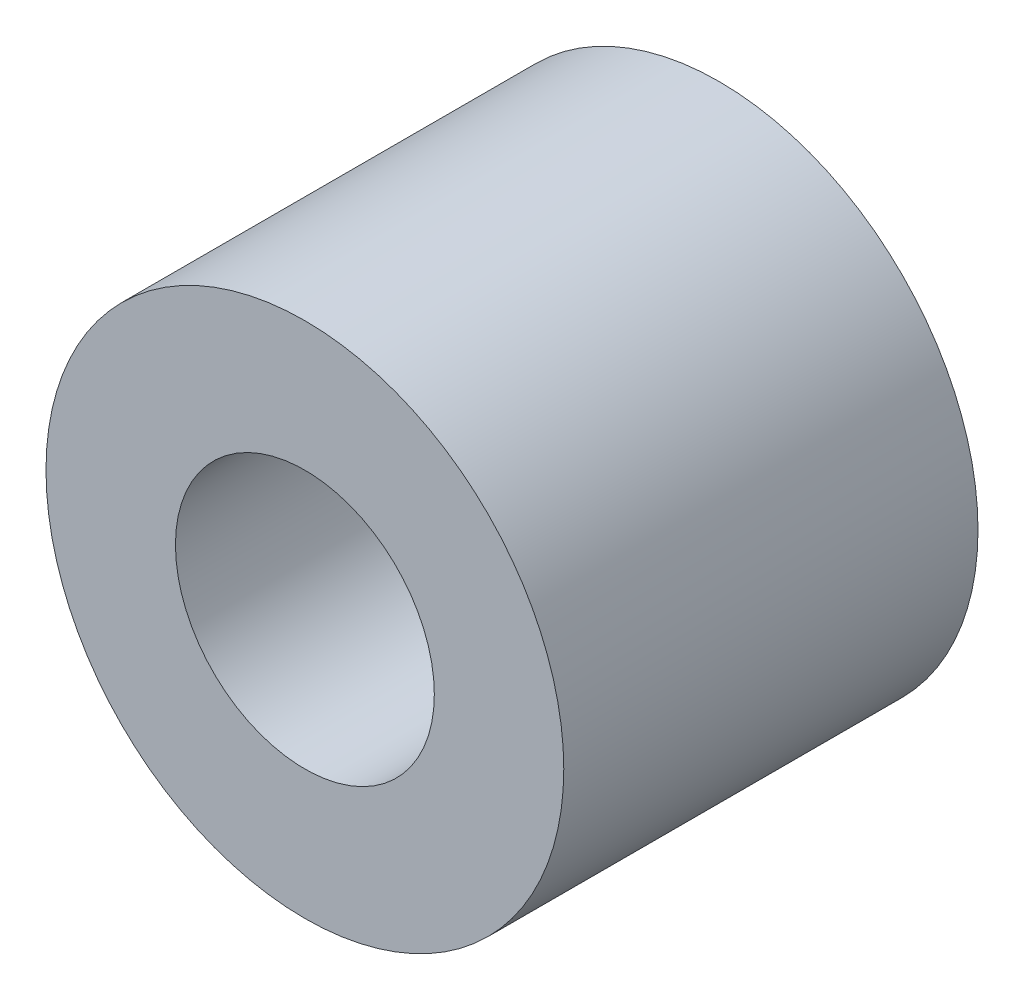
ISO-10303-21;
HEADER;
FILE_DESCRIPTION(('STEP AP214'),'2;1');
FILE_NAME('part.step','',(''),(''),'','','');
FILE_SCHEMA(('AUTOMOTIVE_DESIGN { 1 0 10303 214 1 1 1 1 }'));
ENDSEC;
DATA;
#1=APPLICATION_CONTEXT('core data for automotive mechanical design processes');
#2=APPLICATION_PROTOCOL_DEFINITION('international standard','automotive_design',2000,#1);
#3=PRODUCT_CONTEXT('',#1,'mechanical');
#4=PRODUCT('Part','Part','',(#3));
#5=PRODUCT_RELATED_PRODUCT_CATEGORY('part','',(#4));
#6=PRODUCT_DEFINITION_FORMATION('','',#4);
#7=PRODUCT_DEFINITION_CONTEXT('part definition',#1,'design');
#8=PRODUCT_DEFINITION('design','',#6,#7);
#9=PRODUCT_DEFINITION_SHAPE('','',#8);
#10=(LENGTH_UNIT() NAMED_UNIT(*) SI_UNIT(.MILLI.,.METRE.));
#11=(NAMED_UNIT(*) PLANE_ANGLE_UNIT() SI_UNIT($,.RADIAN.));
#12=(NAMED_UNIT(*) SI_UNIT($,.STERADIAN.) SOLID_ANGLE_UNIT());
#13=UNCERTAINTY_MEASURE_WITH_UNIT(LENGTH_MEASURE(1.E-05),#10,'distance_accuracy_value','');
#14=(GEOMETRIC_REPRESENTATION_CONTEXT(3) GLOBAL_UNCERTAINTY_ASSIGNED_CONTEXT((#13)) GLOBAL_UNIT_ASSIGNED_CONTEXT((#10,
#11,#12)) REPRESENTATION_CONTEXT('',''));
#15=CARTESIAN_POINT('',(0.,0.,0.));
#16=DIRECTION('',(0.,0.,1.));
#17=DIRECTION('',(1.,0.,0.));
#18=AXIS2_PLACEMENT_3D('',#15,#16,#17);
#19=CARTESIAN_POINT('',(0.,0.,5.08));
#20=DIRECTION('',(0.,0.,-1.));
#21=DIRECTION('',(-1.,0.,0.));
#22=AXIS2_PLACEMENT_3D('',#19,#20,#21);
#23=CYLINDRICAL_SURFACE('',#22,3.175);
#24=CARTESIAN_POINT('',(0.,0.,5.08));
#25=DIRECTION('',(0.,0.,1.));
#26=DIRECTION('',(1.,0.,0.));
#27=AXIS2_PLACEMENT_3D('',#24,#25,#26);
#28=CIRCLE('',#27,3.175);
#29=CARTESIAN_POINT('',(3.175,0.,5.08));
#30=VERTEX_POINT('',#29);
#31=EDGE_CURVE('E10',#30,#30,#28,.T.);
#32=ORIENTED_EDGE('',*,*,#31,.F.);
#33=EDGE_LOOP('',(#32));
#34=FACE_BOUND('',#33,.T.);
#35=CARTESIAN_POINT('',(0.,0.,0.));
#36=DIRECTION('',(0.,0.,1.));
#37=DIRECTION('',(1.,0.,0.));
#38=AXIS2_PLACEMENT_3D('',#35,#36,#37);
#39=CIRCLE('',#38,3.175);
#40=CARTESIAN_POINT('',(3.175,0.,0.));
#41=VERTEX_POINT('',#40);
#42=EDGE_CURVE('E34',#41,#41,#39,.T.);
#43=ORIENTED_EDGE('',*,*,#42,.T.);
#44=EDGE_LOOP('',(#43));
#45=FACE_BOUND('',#44,.T.);
#46=ADVANCED_FACE('F31',(#34,#45),#23,.T.);
#47=CARTESIAN_POINT('',(0.,0.,5.08));
#48=DIRECTION('',(0.,0.,1.));
#49=DIRECTION('',(1.,0.,0.));
#50=AXIS2_PLACEMENT_3D('',#47,#48,#49);
#51=PLANE('',#50);
#52=CARTESIAN_POINT('',(0.,0.,5.08));
#53=DIRECTION('',(0.,0.,1.));
#54=DIRECTION('',(1.,0.,0.));
#55=AXIS2_PLACEMENT_3D('',#52,#53,#54);
#56=CIRCLE('',#55,1.5875);
#57=CARTESIAN_POINT('',(1.5875,0.,5.08));
#58=VERTEX_POINT('',#57);
#59=EDGE_CURVE('E43',#58,#58,#56,.T.);
#60=ORIENTED_EDGE('',*,*,#59,.F.);
#61=EDGE_LOOP('',(#60));
#62=FACE_BOUND('',#61,.T.);
#63=ORIENTED_EDGE('',*,*,#31,.T.);
#64=EDGE_LOOP('',(#63));
#65=FACE_BOUND('',#64,.T.);
#66=ADVANCED_FACE('F58',(#62,#65),#51,.T.);
#67=CARTESIAN_POINT('',(0.,0.,0.));
#68=DIRECTION('',(0.,0.,1.));
#69=DIRECTION('',(1.,0.,0.));
#70=AXIS2_PLACEMENT_3D('',#67,#68,#69);
#71=PLANE('',#70);
#72=ORIENTED_EDGE('',*,*,#42,.F.);
#73=EDGE_LOOP('',(#72));
#74=FACE_BOUND('',#73,.T.);
#75=ADVANCED_FACE('F54',(#74),#71,.F.);
#76=CARTESIAN_POINT('',(0.,0.,1.27));
#77=DIRECTION('',(0.,0.,1.));
#78=DIRECTION('',(1.,0.,0.));
#79=AXIS2_PLACEMENT_3D('',#76,#77,#78);
#80=CYLINDRICAL_SURFACE('',#79,1.5875);
#81=CARTESIAN_POINT('',(0.,0.,1.27));
#82=DIRECTION('',(0.,0.,1.));
#83=DIRECTION('',(1.,0.,0.));
#84=AXIS2_PLACEMENT_3D('',#81,#82,#83);
#85=CIRCLE('',#84,1.5875);
#86=CARTESIAN_POINT('',(1.5875,0.,1.27));
#87=VERTEX_POINT('',#86);
#88=EDGE_CURVE('E41',#87,#87,#85,.T.);
#89=CARTESIAN_POINT('',(1.5875,0.,1.27));
#90=CARTESIAN_POINT('',(1.5875,0.,1.3096875));
#91=CARTESIAN_POINT('',(1.5875,0.,1.349375));
#92=CARTESIAN_POINT('',(1.5875,0.,1.42875));
#93=CARTESIAN_POINT('',(1.5875,0.,1.4684375));
#94=CARTESIAN_POINT('',(1.5875,0.,1.5478125));
#95=CARTESIAN_POINT('',(1.5875,0.,1.5875));
#96=CARTESIAN_POINT('',(1.5875,0.,1.666875));
#97=CARTESIAN_POINT('',(1.5875,0.,1.7065625));
#98=CARTESIAN_POINT('',(1.5875,0.,1.7859375));
#99=CARTESIAN_POINT('',(1.5875,0.,1.825625));
#100=CARTESIAN_POINT('',(1.5875,0.,1.905));
#101=CARTESIAN_POINT('',(1.5875,0.,1.9446875));
#102=CARTESIAN_POINT('',(1.5875,0.,2.0240625));
#103=CARTESIAN_POINT('',(1.5875,0.,2.06375));
#104=CARTESIAN_POINT('',(1.5875,0.,2.143125));
#105=CARTESIAN_POINT('',(1.5875,0.,2.1828125));
#106=CARTESIAN_POINT('',(1.5875,0.,2.2621875));
#107=CARTESIAN_POINT('',(1.5875,0.,2.301875));
#108=CARTESIAN_POINT('',(1.5875,0.,2.38125));
#109=CARTESIAN_POINT('',(1.5875,0.,2.4209375));
#110=CARTESIAN_POINT('',(1.5875,0.,2.5003125));
#111=CARTESIAN_POINT('',(1.5875,0.,2.54));
#112=CARTESIAN_POINT('',(1.5875,0.,2.619375));
#113=CARTESIAN_POINT('',(1.5875,0.,2.6590625));
#114=CARTESIAN_POINT('',(1.5875,0.,2.7384375));
#115=CARTESIAN_POINT('',(1.5875,0.,2.778125));
#116=CARTESIAN_POINT('',(1.5875,0.,2.8575));
#117=CARTESIAN_POINT('',(1.5875,0.,2.8971875));
#118=CARTESIAN_POINT('',(1.5875,0.,2.9765625));
#119=CARTESIAN_POINT('',(1.5875,0.,3.01625));
#120=CARTESIAN_POINT('',(1.5875,0.,3.095625));
#121=CARTESIAN_POINT('',(1.5875,0.,3.1353125));
#122=CARTESIAN_POINT('',(1.5875,0.,3.2146875));
#123=CARTESIAN_POINT('',(1.5875,0.,3.254375));
#124=CARTESIAN_POINT('',(1.5875,0.,3.33375));
#125=CARTESIAN_POINT('',(1.5875,0.,3.3734375));
#126=CARTESIAN_POINT('',(1.5875,0.,3.4528125));
#127=CARTESIAN_POINT('',(1.5875,0.,3.4925));
#128=CARTESIAN_POINT('',(1.5875,0.,3.571875));
#129=CARTESIAN_POINT('',(1.5875,0.,3.6115625));
#130=CARTESIAN_POINT('',(1.5875,0.,3.6909375));
#131=CARTESIAN_POINT('',(1.5875,0.,3.730625));
#132=CARTESIAN_POINT('',(1.5875,0.,3.81));
#133=CARTESIAN_POINT('',(1.5875,0.,3.8496875));
#134=CARTESIAN_POINT('',(1.5875,0.,3.9290625));
#135=CARTESIAN_POINT('',(1.5875,0.,3.96875));
#136=CARTESIAN_POINT('',(1.5875,0.,4.048125));
#137=CARTESIAN_POINT('',(1.5875,0.,4.0878125));
#138=CARTESIAN_POINT('',(1.5875,0.,4.1671875));
#139=CARTESIAN_POINT('',(1.5875,0.,4.206875));
#140=CARTESIAN_POINT('',(1.5875,0.,4.28625));
#141=CARTESIAN_POINT('',(1.5875,0.,4.3259375));
#142=CARTESIAN_POINT('',(1.5875,0.,4.4053125));
#143=CARTESIAN_POINT('',(1.5875,0.,4.445));
#144=CARTESIAN_POINT('',(1.5875,0.,4.524375));
#145=CARTESIAN_POINT('',(1.5875,0.,4.5640625));
#146=CARTESIAN_POINT('',(1.5875,0.,4.6434375));
#147=CARTESIAN_POINT('',(1.5875,0.,4.683125));
#148=CARTESIAN_POINT('',(1.5875,0.,4.7625));
#149=CARTESIAN_POINT('',(1.5875,0.,4.8021875));
#150=CARTESIAN_POINT('',(1.5875,0.,4.8815625));
#151=CARTESIAN_POINT('',(1.5875,0.,4.92125));
#152=CARTESIAN_POINT('',(1.5875,0.,5.000625));
#153=CARTESIAN_POINT('',(1.5875,0.,5.0403125));
#154=CARTESIAN_POINT('',(1.5875,0.,5.08));
#155=B_SPLINE_CURVE_WITH_KNOTS('',3,(#89,#90,#91,#92,#93,#94,#95,#96,#97,#98,#99,#100,#101,#102,
#103,#104,#105,#106,#107,#108,#109,#110,#111,#112,#113,#114,#115,#116,#117,#118,#119,#120,#121,
#122,#123,#124,#125,#126,#127,#128,#129,#130,#131,#132,#133,#134,#135,#136,#137,#138,#139,#140,
#141,#142,#143,#144,#145,#146,#147,#148,#149,#150,#151,#152,#153,#154),.UNSPECIFIED.,.F.,.F.,(4,
2,2,2,2,2,2,2,2,2,2,2,2,2,2,2,2,2,2,2,2,2,2,2,2,2,2,2,2,2,2,2,4),(0.,0.1190625,0.238125,
0.3571875,0.47625,0.5953125,0.714375,0.8334375,0.9525,1.0715625,1.190625,1.3096875,1.42875,
1.5478125,1.666875,1.7859375,1.905,2.0240625,2.143125,2.2621875,2.38125,2.5003125,2.619375,
2.7384375,2.8575,2.9765625,3.095625,3.2146875,3.33375,3.4528125,3.571875,3.6909375,3.81),.UNSPECIFIED.);
#156=EDGE_CURVE('BSEAM51',#87,#58,#155,.T.);
#157=ORIENTED_EDGE('',*,*,#88,.F.);
#158=ORIENTED_EDGE('',*,*,#59,.T.);
#159=ORIENTED_EDGE('',*,*,#156,.T.);
#160=ORIENTED_EDGE('',*,*,#156,.F.);
#161=EDGE_LOOP('',(#157,#159,#158,#160));
#162=FACE_BOUND('',#161,.T.);
#163=ADVANCED_FACE('F51',(#162),#80,.F.);
#164=CARTESIAN_POINT('',(0.,0.,1.27));
#165=DIRECTION('',(0.,0.,1.));
#166=DIRECTION('',(1.,0.,0.));
#167=AXIS2_PLACEMENT_3D('',#164,#165,#166);
#168=PLANE('',#167);
#169=ORIENTED_EDGE('',*,*,#88,.T.);
#170=EDGE_LOOP('',(#169));
#171=FACE_BOUND('',#170,.T.);
#172=ADVANCED_FACE('F49',(#171),#168,.T.);
#173=CLOSED_SHELL('',(#46,#66,#75,#163,#172));
#174=MANIFOLD_SOLID_BREP('B2',#173);
#175=ADVANCED_BREP_SHAPE_REPRESENTATION('',(#18,#174),#14);
#176=SHAPE_DEFINITION_REPRESENTATION(#9,#175);
ENDSEC;
END-ISO-10303-21;
